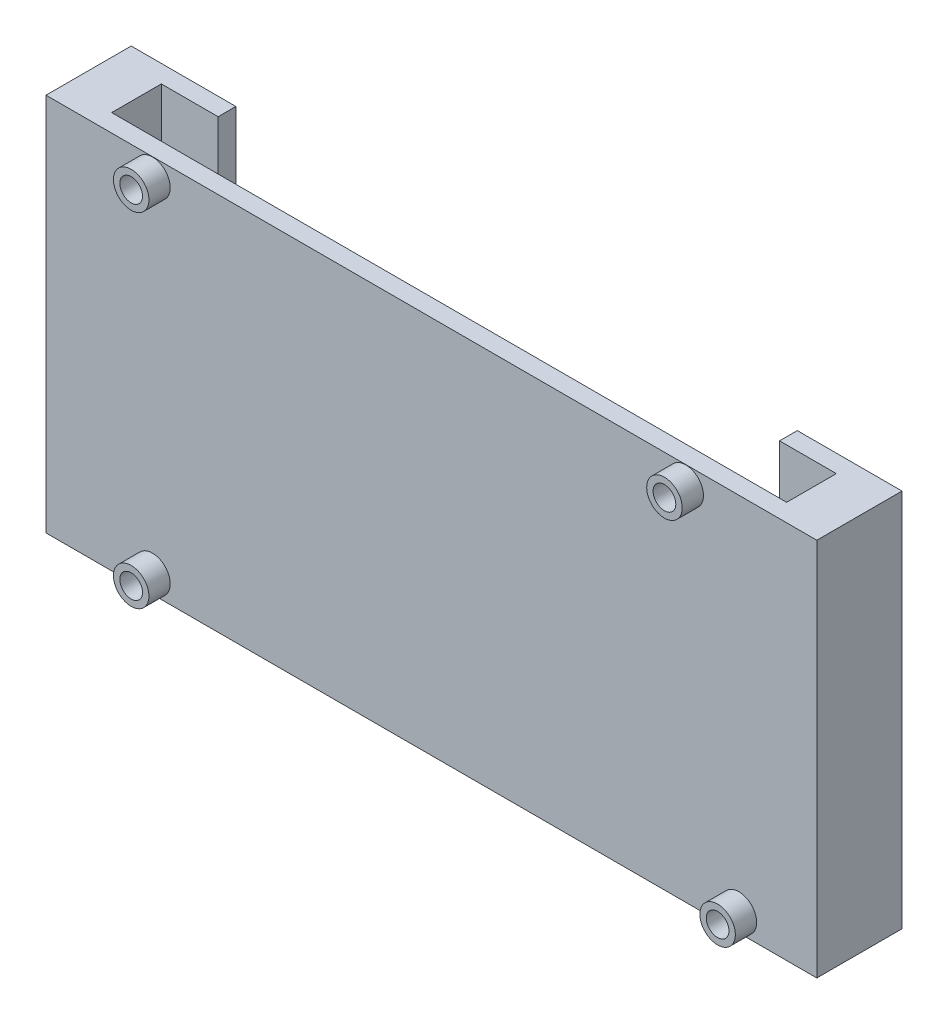
ISO-10303-21;
HEADER;
FILE_DESCRIPTION(('STEP AP214'),'2;1');
FILE_NAME('part.step','',(''),(''),'','','');
FILE_SCHEMA(('AUTOMOTIVE_DESIGN { 1 0 10303 214 1 1 1 1 }'));
ENDSEC;
DATA;
#1=APPLICATION_CONTEXT('core data for automotive mechanical design processes');
#2=APPLICATION_PROTOCOL_DEFINITION('international standard','automotive_design',2000,#1);
#3=PRODUCT_CONTEXT('',#1,'mechanical');
#4=PRODUCT('Part','Part','',(#3));
#5=PRODUCT_RELATED_PRODUCT_CATEGORY('part','',(#4));
#6=PRODUCT_DEFINITION_FORMATION('','',#4);
#7=PRODUCT_DEFINITION_CONTEXT('part definition',#1,'design');
#8=PRODUCT_DEFINITION('design','',#6,#7);
#9=PRODUCT_DEFINITION_SHAPE('','',#8);
#10=(LENGTH_UNIT() NAMED_UNIT(*) SI_UNIT(.MILLI.,.METRE.));
#11=(NAMED_UNIT(*) PLANE_ANGLE_UNIT() SI_UNIT($,.RADIAN.));
#12=(NAMED_UNIT(*) SI_UNIT($,.STERADIAN.) SOLID_ANGLE_UNIT());
#13=UNCERTAINTY_MEASURE_WITH_UNIT(LENGTH_MEASURE(1.E-05),#10,'distance_accuracy_value','');
#14=(GEOMETRIC_REPRESENTATION_CONTEXT(3) GLOBAL_UNCERTAINTY_ASSIGNED_CONTEXT((#13)) GLOBAL_UNIT_ASSIGNED_CONTEXT((#10,
#11,#12)) REPRESENTATION_CONTEXT('',''));
#15=CARTESIAN_POINT('',(0.,0.,0.));
#16=DIRECTION('',(0.,0.,1.));
#17=DIRECTION('',(1.,0.,0.));
#18=AXIS2_PLACEMENT_3D('',#15,#16,#17);
#19=CARTESIAN_POINT('',(-47.55,26.7081,-9.5));
#20=DIRECTION('',(-1.,0.,0.));
#21=DIRECTION('',(0.,-1.,0.));
#22=AXIS2_PLACEMENT_3D('',#19,#20,#21);
#23=PLANE('',#22);
#24=DIRECTION('',(0.,-1.,0.));
#25=VECTOR('',#24,1.);
#26=CARTESIAN_POINT('',(-47.55,26.7081,-7.));
#27=LINE('',#26,#25);
#28=CARTESIAN_POINT('',(-47.55,26.7081,-7.));
#29=VERTEX_POINT('',#28);
#30=CARTESIAN_POINT('',(-47.55,-26.7081,-7.00000000000001));
#31=VERTEX_POINT('',#30);
#32=EDGE_CURVE('E167',#29,#31,#27,.T.);
#33=ORIENTED_EDGE('',*,*,#32,.F.);
#34=DIRECTION('',(0.,0.,1.));
#35=VECTOR('',#34,1.);
#36=CARTESIAN_POINT('',(-47.55,26.7081,-9.5));
#37=LINE('',#36,#35);
#38=CARTESIAN_POINT('',(-47.55,26.7081,0.));
#39=VERTEX_POINT('',#38);
#40=EDGE_CURVE('E209',#29,#39,#37,.T.);
#41=ORIENTED_EDGE('',*,*,#40,.T.);
#42=DIRECTION('',(0.,-1.,0.));
#43=VECTOR('',#42,1.);
#44=CARTESIAN_POINT('',(-47.55,26.7081,0.));
#45=LINE('',#44,#43);
#46=CARTESIAN_POINT('',(-47.55,-26.7081,0.));
#47=VERTEX_POINT('',#46);
#48=EDGE_CURVE('E214',#39,#47,#45,.T.);
#49=ORIENTED_EDGE('',*,*,#48,.T.);
#50=DIRECTION('',(0.,0.,1.));
#51=VECTOR('',#50,1.);
#52=CARTESIAN_POINT('',(-47.55,-26.7081,-9.5));
#53=LINE('',#52,#51);
#54=EDGE_CURVE('E61',#31,#47,#53,.T.);
#55=ORIENTED_EDGE('',*,*,#54,.F.);
#56=EDGE_LOOP('',(#33,#41,#49,#55));
#57=FACE_BOUND('',#56,.T.);
#58=ADVANCED_FACE('F45',(#57),#23,.F.);
#59=CARTESIAN_POINT('',(47.55,26.7081,-9.5));
#60=DIRECTION('',(1.,0.,0.));
#61=DIRECTION('',(0.,1.,0.));
#62=AXIS2_PLACEMENT_3D('',#59,#60,#61);
#63=PLANE('',#62);
#64=DIRECTION('',(0.,1.,0.));
#65=VECTOR('',#64,1.);
#66=CARTESIAN_POINT('',(47.55,26.7081,-7.));
#67=LINE('',#66,#65);
#68=CARTESIAN_POINT('',(47.55,-26.7081,-6.99999999999999));
#69=VERTEX_POINT('',#68);
#70=CARTESIAN_POINT('',(47.55,26.7081,-7.));
#71=VERTEX_POINT('',#70);
#72=EDGE_CURVE('E185',#69,#71,#67,.T.);
#73=ORIENTED_EDGE('',*,*,#72,.F.);
#74=DIRECTION('',(0.,0.,1.));
#75=VECTOR('',#74,1.);
#76=CARTESIAN_POINT('',(47.55,-26.7081,-9.5));
#77=LINE('',#76,#75);
#78=CARTESIAN_POINT('',(47.55,-26.7081,0.));
#79=VERTEX_POINT('',#78);
#80=EDGE_CURVE('E69',#69,#79,#77,.T.);
#81=ORIENTED_EDGE('',*,*,#80,.T.);
#82=DIRECTION('',(0.,1.,0.));
#83=VECTOR('',#82,1.);
#84=CARTESIAN_POINT('',(47.55,26.7081,0.));
#85=LINE('',#84,#83);
#86=CARTESIAN_POINT('',(47.55,26.7081,0.));
#87=VERTEX_POINT('',#86);
#88=EDGE_CURVE('E217',#79,#87,#85,.T.);
#89=ORIENTED_EDGE('',*,*,#88,.T.);
#90=DIRECTION('',(0.,0.,1.));
#91=VECTOR('',#90,1.);
#92=CARTESIAN_POINT('',(47.55,26.7081,-9.5));
#93=LINE('',#92,#91);
#94=EDGE_CURVE('E233',#71,#87,#93,.T.);
#95=ORIENTED_EDGE('',*,*,#94,.F.);
#96=EDGE_LOOP('',(#73,#81,#89,#95));
#97=FACE_BOUND('',#96,.T.);
#98=ADVANCED_FACE('F364',(#97),#63,.F.);
#99=CARTESIAN_POINT('',(0.,0.,0.));
#100=DIRECTION('',(0.,0.,-1.));
#101=DIRECTION('',(-1.,0.,0.));
#102=AXIS2_PLACEMENT_3D('',#99,#100,#101);
#103=PLANE('',#102);
#104=CARTESIAN_POINT('',(-39.3,24.1681,0.));
#105=DIRECTION('',(0.,0.,1.));
#106=DIRECTION('',(1.,0.,0.));
#107=AXIS2_PLACEMENT_3D('',#104,#105,#106);
#108=CIRCLE('',#107,1.6);
#109=CARTESIAN_POINT('',(-37.7,24.1681,0.));
#110=VERTEX_POINT('',#109);
#111=EDGE_CURVE('E244',#110,#110,#108,.T.);
#112=ORIENTED_EDGE('',*,*,#111,.T.);
#113=EDGE_LOOP('',(#112));
#114=FACE_BOUND('',#113,.T.);
#115=CARTESIAN_POINT('',(35.83,24.1681,0.));
#116=DIRECTION('',(0.,0.,1.));
#117=DIRECTION('',(1.,0.,0.));
#118=AXIS2_PLACEMENT_3D('',#115,#116,#117);
#119=CIRCLE('',#118,1.6);
#120=CARTESIAN_POINT('',(37.43,24.1681,0.));
#121=VERTEX_POINT('',#120);
#122=EDGE_CURVE('E252',#121,#121,#119,.T.);
#123=ORIENTED_EDGE('',*,*,#122,.T.);
#124=EDGE_LOOP('',(#123));
#125=FACE_BOUND('',#124,.T.);
#126=CARTESIAN_POINT('',(43.32,-24.16810902,0.));
#127=DIRECTION('',(0.,0.,1.));
#128=DIRECTION('',(1.,0.,0.));
#129=AXIS2_PLACEMENT_3D('',#126,#127,#128);
#130=CIRCLE('',#129,1.6);
#131=CARTESIAN_POINT('',(44.92,-24.16810902,0.));
#132=VERTEX_POINT('',#131);
#133=EDGE_CURVE('E260',#132,#132,#130,.T.);
#134=ORIENTED_EDGE('',*,*,#133,.T.);
#135=EDGE_LOOP('',(#134));
#136=FACE_BOUND('',#135,.T.);
#137=CARTESIAN_POINT('',(-39.3,-24.16810902,0.));
#138=DIRECTION('',(0.,0.,1.));
#139=DIRECTION('',(1.,0.,0.));
#140=AXIS2_PLACEMENT_3D('',#137,#138,#139);
#141=CIRCLE('',#140,1.6);
#142=CARTESIAN_POINT('',(-37.7,-24.16810902,0.));
#143=VERTEX_POINT('',#142);
#144=EDGE_CURVE('E268',#143,#143,#141,.T.);
#145=ORIENTED_EDGE('',*,*,#144,.T.);
#146=EDGE_LOOP('',(#145));
#147=FACE_BOUND('',#146,.T.);
#148=DIRECTION('',(1.,0.,0.));
#149=VECTOR('',#148,1.);
#150=CARTESIAN_POINT('',(-54.3,-26.7081,0.));
#151=LINE('',#150,#149);
#152=EDGE_CURVE('E294',#47,#79,#151,.T.);
#153=ORIENTED_EDGE('',*,*,#152,.F.);
#154=ORIENTED_EDGE('',*,*,#48,.F.);
#155=DIRECTION('',(-1.,0.,0.));
#156=VECTOR('',#155,1.);
#157=CARTESIAN_POINT('',(-54.3,26.7081,0.));
#158=LINE('',#157,#156);
#159=EDGE_CURVE('E288',#87,#39,#158,.T.);
#160=ORIENTED_EDGE('',*,*,#159,.F.);
#161=ORIENTED_EDGE('',*,*,#88,.F.);
#162=EDGE_LOOP('',(#153,#154,#160,#161));
#163=FACE_BOUND('',#162,.T.);
#164=ADVANCED_FACE('F368',(#114,#125,#136,#147,#163),#103,.T.);
#165=CARTESIAN_POINT('',(54.3,-26.7081,2.5));
#166=DIRECTION('',(-1.,0.,0.));
#167=DIRECTION('',(0.,0.,1.));
#168=AXIS2_PLACEMENT_3D('',#165,#166,#167);
#169=PLANE('',#168);
#170=DIRECTION('',(0.,0.,-1.));
#171=VECTOR('',#170,1.);
#172=CARTESIAN_POINT('',(54.3,-26.7081,2.5));
#173=LINE('',#172,#171);
#174=CARTESIAN_POINT('',(54.3,-26.7081,2.5));
#175=VERTEX_POINT('',#174);
#176=CARTESIAN_POINT('',(54.3,-26.7081,-9.5));
#177=VERTEX_POINT('',#176);
#178=EDGE_CURVE('E303',#175,#177,#173,.T.);
#179=ORIENTED_EDGE('',*,*,#178,.T.);
#180=DIRECTION('',(0.,-1.,0.));
#181=VECTOR('',#180,1.);
#182=CARTESIAN_POINT('',(54.3,26.7081,-9.5));
#183=LINE('',#182,#181);
#184=CARTESIAN_POINT('',(54.3,26.7081,-9.5));
#185=VERTEX_POINT('',#184);
#186=EDGE_CURVE('E222',#185,#177,#183,.T.);
#187=ORIENTED_EDGE('',*,*,#186,.F.);
#188=DIRECTION('',(0.,0.,-1.));
#189=VECTOR('',#188,1.);
#190=CARTESIAN_POINT('',(54.3,26.7081,2.5));
#191=LINE('',#190,#189);
#192=CARTESIAN_POINT('',(54.3,26.7081,2.5));
#193=VERTEX_POINT('',#192);
#194=EDGE_CURVE('E317',#193,#185,#191,.T.);
#195=ORIENTED_EDGE('',*,*,#194,.F.);
#196=DIRECTION('',(0.,1.,0.));
#197=VECTOR('',#196,1.);
#198=CARTESIAN_POINT('',(54.3,-26.7081,2.5));
#199=LINE('',#198,#197);
#200=EDGE_CURVE('E289',#175,#193,#199,.T.);
#201=ORIENTED_EDGE('',*,*,#200,.F.);
#202=EDGE_LOOP('',(#179,#187,#195,#201));
#203=FACE_BOUND('',#202,.T.);
#204=ADVANCED_FACE('F47',(#203),#169,.F.);
#205=CARTESIAN_POINT('',(-54.3,26.7081,2.5));
#206=DIRECTION('',(0.,-1.,0.));
#207=DIRECTION('',(0.,0.,-1.));
#208=AXIS2_PLACEMENT_3D('',#205,#206,#207);
#209=PLANE('',#208);
#210=ORIENTED_EDGE('',*,*,#194,.T.);
#211=DIRECTION('',(1.,0.,0.));
#212=VECTOR('',#211,1.);
#213=CARTESIAN_POINT('',(54.3,26.7081,-9.5));
#214=LINE('',#213,#212);
#215=CARTESIAN_POINT('',(39.55,26.7081,-9.5));
#216=VERTEX_POINT('',#215);
#217=EDGE_CURVE('E229',#216,#185,#214,.T.);
#218=ORIENTED_EDGE('',*,*,#217,.F.);
#219=DIRECTION('',(0.,0.,-1.));
#220=VECTOR('',#219,1.);
#221=CARTESIAN_POINT('',(39.55,26.7081,-9.5));
#222=LINE('',#221,#220);
#223=CARTESIAN_POINT('',(39.55,26.7081,-7.));
#224=VERTEX_POINT('',#223);
#225=EDGE_CURVE('E196',#224,#216,#222,.T.);
#226=ORIENTED_EDGE('',*,*,#225,.F.);
#227=DIRECTION('',(1.,0.,0.));
#228=VECTOR('',#227,1.);
#229=CARTESIAN_POINT('',(39.55,26.7081,-7.));
#230=LINE('',#229,#228);
#231=EDGE_CURVE('E200',#224,#71,#230,.T.);
#232=ORIENTED_EDGE('',*,*,#231,.T.);
#233=ORIENTED_EDGE('',*,*,#94,.T.);
#234=ORIENTED_EDGE('',*,*,#159,.T.);
#235=ORIENTED_EDGE('',*,*,#40,.F.);
#236=DIRECTION('',(-1.,0.,0.));
#237=VECTOR('',#236,1.);
#238=CARTESIAN_POINT('',(-39.55,26.7081,-7.));
#239=LINE('',#238,#237);
#240=CARTESIAN_POINT('',(-39.55,26.7081,-7.));
#241=VERTEX_POINT('',#240);
#242=EDGE_CURVE('E156',#241,#29,#239,.T.);
#243=ORIENTED_EDGE('',*,*,#242,.F.);
#244=DIRECTION('',(0.,0.,1.));
#245=VECTOR('',#244,1.);
#246=CARTESIAN_POINT('',(-39.55,26.7081,-9.5));
#247=LINE('',#246,#245);
#248=CARTESIAN_POINT('',(-39.55,26.7081,-9.5));
#249=VERTEX_POINT('',#248);
#250=EDGE_CURVE('E153',#249,#241,#247,.T.);
#251=ORIENTED_EDGE('',*,*,#250,.F.);
#252=DIRECTION('',(1.,0.,0.));
#253=VECTOR('',#252,1.);
#254=CARTESIAN_POINT('',(-54.3,26.7081,-9.5));
#255=LINE('',#254,#253);
#256=CARTESIAN_POINT('',(-54.3,26.7081,-9.5));
#257=VERTEX_POINT('',#256);
#258=EDGE_CURVE('E139',#257,#249,#255,.T.);
#259=ORIENTED_EDGE('',*,*,#258,.F.);
#260=DIRECTION('',(0.,0.,-1.));
#261=VECTOR('',#260,1.);
#262=CARTESIAN_POINT('',(-54.3,26.7081,2.5));
#263=LINE('',#262,#261);
#264=CARTESIAN_POINT('',(-54.3,26.7081,2.5));
#265=VERTEX_POINT('',#264);
#266=EDGE_CURVE('E314',#265,#257,#263,.T.);
#267=ORIENTED_EDGE('',*,*,#266,.F.);
#268=DIRECTION('',(-1.,0.,0.));
#269=VECTOR('',#268,1.);
#270=CARTESIAN_POINT('',(-54.3,26.7081,2.5));
#271=LINE('',#270,#269);
#272=EDGE_CURVE('E293',#193,#265,#271,.T.);
#273=ORIENTED_EDGE('',*,*,#272,.F.);
#274=EDGE_LOOP('',(#210,#218,#226,#232,#233,#234,#235,#243,#251,#259,#267,#273));
#275=FACE_BOUND('',#274,.T.);
#276=ADVANCED_FACE('F154',(#275),#209,.F.);
#277=CARTESIAN_POINT('',(-54.3,-26.7081,2.5));
#278=DIRECTION('',(1.,0.,0.));
#279=DIRECTION('',(0.,0.,-1.));
#280=AXIS2_PLACEMENT_3D('',#277,#278,#279);
#281=PLANE('',#280);
#282=ORIENTED_EDGE('',*,*,#266,.T.);
#283=DIRECTION('',(0.,1.,0.));
#284=VECTOR('',#283,1.);
#285=CARTESIAN_POINT('',(-54.3,26.7081,-9.5));
#286=LINE('',#285,#284);
#287=CARTESIAN_POINT('',(-54.3,-26.7081,-9.5));
#288=VERTEX_POINT('',#287);
#289=EDGE_CURVE('E146',#288,#257,#286,.T.);
#290=ORIENTED_EDGE('',*,*,#289,.F.);
#291=DIRECTION('',(0.,0.,-1.));
#292=VECTOR('',#291,1.);
#293=CARTESIAN_POINT('',(-54.3,-26.7081,2.5));
#294=LINE('',#293,#292);
#295=CARTESIAN_POINT('',(-54.3,-26.7081,2.5));
#296=VERTEX_POINT('',#295);
#297=EDGE_CURVE('E311',#296,#288,#294,.T.);
#298=ORIENTED_EDGE('',*,*,#297,.F.);
#299=DIRECTION('',(0.,-1.,0.));
#300=VECTOR('',#299,1.);
#301=CARTESIAN_POINT('',(-54.3,-26.7081,2.5));
#302=LINE('',#301,#300);
#303=EDGE_CURVE('E297',#265,#296,#302,.T.);
#304=ORIENTED_EDGE('',*,*,#303,.F.);
#305=EDGE_LOOP('',(#282,#290,#298,#304));
#306=FACE_BOUND('',#305,.T.);
#307=ADVANCED_FACE('F377',(#306),#281,.F.);
#308=CARTESIAN_POINT('',(-54.3,-26.7081,2.5));
#309=DIRECTION('',(0.,1.,0.));
#310=DIRECTION('',(0.,0.,1.));
#311=AXIS2_PLACEMENT_3D('',#308,#309,#310);
#312=PLANE('',#311);
#313=CARTESIAN_POINT('',(-50.925,-26.7081,-3.5));
#314=DIRECTION('',(0.,-1.,0.));
#315=DIRECTION('',(0.,0.,-1.));
#316=AXIS2_PLACEMENT_3D('',#313,#314,#315);
#317=CIRCLE('',#316,3.15);
#318=CARTESIAN_POINT('',(-50.925,-26.7081,-6.65));
#319=VERTEX_POINT('',#318);
#320=EDGE_CURVE('E576',#319,#319,#317,.T.);
#321=ORIENTED_EDGE('',*,*,#320,.F.);
#322=EDGE_LOOP('',(#321));
#323=FACE_BOUND('',#322,.T.);
#324=CARTESIAN_POINT('',(50.925,-26.7081,-3.5));
#325=DIRECTION('',(0.,-1.,0.));
#326=DIRECTION('',(0.,0.,-1.));
#327=AXIS2_PLACEMENT_3D('',#324,#325,#326);
#328=CIRCLE('',#327,3.15);
#329=CARTESIAN_POINT('',(50.925,-26.7081,-6.65));
#330=VERTEX_POINT('',#329);
#331=EDGE_CURVE('E580',#330,#330,#328,.T.);
#332=ORIENTED_EDGE('',*,*,#331,.F.);
#333=EDGE_LOOP('',(#332));
#334=FACE_BOUND('',#333,.T.);
#335=ORIENTED_EDGE('',*,*,#297,.T.);
#336=DIRECTION('',(-1.,0.,0.));
#337=VECTOR('',#336,1.);
#338=CARTESIAN_POINT('',(-54.3,-26.7081,-9.5));
#339=LINE('',#338,#337);
#340=CARTESIAN_POINT('',(-39.55,-26.7081,-9.50000000000001));
#341=VERTEX_POINT('',#340);
#342=EDGE_CURVE('E150',#341,#288,#339,.T.);
#343=ORIENTED_EDGE('',*,*,#342,.F.);
#344=DIRECTION('',(0.,0.,-1.));
#345=VECTOR('',#344,1.);
#346=CARTESIAN_POINT('',(-39.55,-26.7081,-9.50000000000001));
#347=LINE('',#346,#345);
#348=CARTESIAN_POINT('',(-39.55,-26.7081,-7.00000000000001));
#349=VERTEX_POINT('',#348);
#350=EDGE_CURVE('E165',#349,#341,#347,.T.);
#351=ORIENTED_EDGE('',*,*,#350,.F.);
#352=DIRECTION('',(-1.,0.,0.));
#353=VECTOR('',#352,1.);
#354=CARTESIAN_POINT('',(-39.55,-26.7081,-7.00000000000001));
#355=LINE('',#354,#353);
#356=EDGE_CURVE('E179',#349,#31,#355,.T.);
#357=ORIENTED_EDGE('',*,*,#356,.T.);
#358=ORIENTED_EDGE('',*,*,#54,.T.);
#359=ORIENTED_EDGE('',*,*,#152,.T.);
#360=ORIENTED_EDGE('',*,*,#80,.F.);
#361=DIRECTION('',(1.,0.,0.));
#362=VECTOR('',#361,1.);
#363=CARTESIAN_POINT('',(39.55,-26.7081,-6.99999999999999));
#364=LINE('',#363,#362);
#365=CARTESIAN_POINT('',(39.55,-26.7081,-6.99999999999999));
#366=VERTEX_POINT('',#365);
#367=EDGE_CURVE('E206',#366,#69,#364,.T.);
#368=ORIENTED_EDGE('',*,*,#367,.F.);
#369=DIRECTION('',(0.,0.,1.));
#370=VECTOR('',#369,1.);
#371=CARTESIAN_POINT('',(39.55,-26.7081,-9.49999999999999));
#372=LINE('',#371,#370);
#373=CARTESIAN_POINT('',(39.55,-26.7081,-9.49999999999999));
#374=VERTEX_POINT('',#373);
#375=EDGE_CURVE('E190',#374,#366,#372,.T.);
#376=ORIENTED_EDGE('',*,*,#375,.F.);
#377=DIRECTION('',(-1.,0.,0.));
#378=VECTOR('',#377,1.);
#379=CARTESIAN_POINT('',(54.3,-26.7081,-9.5));
#380=LINE('',#379,#378);
#381=EDGE_CURVE('E226',#177,#374,#380,.T.);
#382=ORIENTED_EDGE('',*,*,#381,.F.);
#383=ORIENTED_EDGE('',*,*,#178,.F.);
#384=DIRECTION('',(1.,0.,0.));
#385=VECTOR('',#384,1.);
#386=CARTESIAN_POINT('',(-54.3,-26.7081,2.5));
#387=LINE('',#386,#385);
#388=EDGE_CURVE('E300',#296,#175,#387,.T.);
#389=ORIENTED_EDGE('',*,*,#388,.F.);
#390=EDGE_LOOP('',(#335,#343,#351,#357,#358,#359,#360,#368,#376,#382,#383,#389));
#391=FACE_BOUND('',#390,.T.);
#392=ADVANCED_FACE('F337',(#323,#334,#391),#312,.F.);
#393=CARTESIAN_POINT('',(0.,0.,2.5));
#394=DIRECTION('',(0.,0.,-1.));
#395=DIRECTION('',(-1.,0.,0.));
#396=AXIS2_PLACEMENT_3D('',#393,#394,#395);
#397=PLANE('',#396);
#398=CARTESIAN_POINT('',(-39.3,-24.16810902,2.5));
#399=DIRECTION('',(0.,0.,-1.));
#400=DIRECTION('',(-1.,0.,0.));
#401=AXIS2_PLACEMENT_3D('',#398,#399,#400);
#402=CIRCLE('',#401,2.5);
#403=CARTESIAN_POINT('',(-41.8,-24.16810902,2.5));
#404=VERTEX_POINT('',#403);
#405=EDGE_CURVE('E11',#404,#404,#402,.F.);
#406=ORIENTED_EDGE('',*,*,#405,.F.);
#407=EDGE_LOOP('',(#406));
#408=FACE_BOUND('',#407,.T.);
#409=CARTESIAN_POINT('',(43.32,-24.16810902,2.5));
#410=DIRECTION('',(0.,0.,-1.));
#411=DIRECTION('',(-1.,0.,0.));
#412=AXIS2_PLACEMENT_3D('',#409,#410,#411);
#413=CIRCLE('',#412,2.5);
#414=CARTESIAN_POINT('',(40.82,-24.16810902,2.5));
#415=VERTEX_POINT('',#414);
#416=EDGE_CURVE('E54',#415,#415,#413,.F.);
#417=ORIENTED_EDGE('',*,*,#416,.F.);
#418=EDGE_LOOP('',(#417));
#419=FACE_BOUND('',#418,.T.);
#420=CARTESIAN_POINT('',(35.83,24.1681,2.5));
#421=DIRECTION('',(0.,0.,-1.));
#422=DIRECTION('',(-1.,0.,0.));
#423=AXIS2_PLACEMENT_3D('',#420,#421,#422);
#424=CIRCLE('',#423,2.5);
#425=CARTESIAN_POINT('',(33.33,24.1681,2.5));
#426=VERTEX_POINT('',#425);
#427=EDGE_CURVE('E324',#426,#426,#424,.F.);
#428=ORIENTED_EDGE('',*,*,#427,.F.);
#429=EDGE_LOOP('',(#428));
#430=FACE_BOUND('',#429,.T.);
#431=CARTESIAN_POINT('',(-39.3,24.1681,2.5));
#432=DIRECTION('',(0.,0.,-1.));
#433=DIRECTION('',(-1.,0.,0.));
#434=AXIS2_PLACEMENT_3D('',#431,#432,#433);
#435=CIRCLE('',#434,2.5);
#436=CARTESIAN_POINT('',(-41.8,24.1681,2.5));
#437=VERTEX_POINT('',#436);
#438=EDGE_CURVE('E320',#437,#437,#435,.F.);
#439=ORIENTED_EDGE('',*,*,#438,.F.);
#440=EDGE_LOOP('',(#439));
#441=FACE_BOUND('',#440,.T.);
#442=ORIENTED_EDGE('',*,*,#200,.T.);
#443=ORIENTED_EDGE('',*,*,#272,.T.);
#444=ORIENTED_EDGE('',*,*,#303,.T.);
#445=ORIENTED_EDGE('',*,*,#388,.T.);
#446=EDGE_LOOP('',(#442,#443,#444,#445));
#447=FACE_BOUND('',#446,.T.);
#448=ADVANCED_FACE('F333',(#408,#419,#430,#441,#447),#397,.F.);
#449=CARTESIAN_POINT('',(-39.3,24.1681,5.5));
#450=DIRECTION('',(0.,0.,-1.));
#451=DIRECTION('',(-1.,0.,0.));
#452=AXIS2_PLACEMENT_3D('',#449,#450,#451);
#453=CYLINDRICAL_SURFACE('',#452,2.5);
#454=CARTESIAN_POINT('',(-39.3,24.1681,5.5));
#455=DIRECTION('',(0.,0.,1.));
#456=DIRECTION('',(1.,0.,0.));
#457=AXIS2_PLACEMENT_3D('',#454,#455,#456);
#458=CIRCLE('',#457,2.5);
#459=CARTESIAN_POINT('',(-36.8,24.1681,5.5));
#460=VERTEX_POINT('',#459);
#461=EDGE_CURVE('E284',#460,#460,#458,.T.);
#462=ORIENTED_EDGE('',*,*,#461,.F.);
#463=EDGE_LOOP('',(#462));
#464=FACE_BOUND('',#463,.T.);
#465=ORIENTED_EDGE('',*,*,#438,.T.);
#466=EDGE_LOOP('',(#465));
#467=FACE_BOUND('',#466,.T.);
#468=ADVANCED_FACE('F336',(#464,#467),#453,.T.);
#469=CARTESIAN_POINT('',(-39.3,24.1681,5.5));
#470=DIRECTION('',(0.,0.,1.));
#471=DIRECTION('',(1.,0.,0.));
#472=AXIS2_PLACEMENT_3D('',#469,#470,#471);
#473=PLANE('',#472);
#474=CARTESIAN_POINT('',(-39.3,24.1681,5.5));
#475=DIRECTION('',(0.,0.,1.));
#476=DIRECTION('',(1.,0.,0.));
#477=AXIS2_PLACEMENT_3D('',#474,#475,#476);
#478=CIRCLE('',#477,1.6);
#479=CARTESIAN_POINT('',(-37.7,24.1681,5.5));
#480=VERTEX_POINT('',#479);
#481=EDGE_CURVE('E240',#480,#480,#478,.T.);
#482=ORIENTED_EDGE('',*,*,#481,.F.);
#483=EDGE_LOOP('',(#482));
#484=FACE_BOUND('',#483,.T.);
#485=ORIENTED_EDGE('',*,*,#461,.T.);
#486=EDGE_LOOP('',(#485));
#487=FACE_BOUND('',#486,.T.);
#488=ADVANCED_FACE('F433',(#484,#487),#473,.T.);
#489=CARTESIAN_POINT('',(35.83,24.1681,5.5));
#490=DIRECTION('',(0.,0.,-1.));
#491=DIRECTION('',(-1.,0.,0.));
#492=AXIS2_PLACEMENT_3D('',#489,#490,#491);
#493=CYLINDRICAL_SURFACE('',#492,2.5);
#494=CARTESIAN_POINT('',(35.83,24.1681,5.5));
#495=DIRECTION('',(0.,0.,1.));
#496=DIRECTION('',(1.,0.,0.));
#497=AXIS2_PLACEMENT_3D('',#494,#495,#496);
#498=CIRCLE('',#497,2.5);
#499=CARTESIAN_POINT('',(38.33,24.1681,5.5));
#500=VERTEX_POINT('',#499);
#501=EDGE_CURVE('E280',#500,#500,#498,.T.);
#502=ORIENTED_EDGE('',*,*,#501,.F.);
#503=EDGE_LOOP('',(#502));
#504=FACE_BOUND('',#503,.T.);
#505=ORIENTED_EDGE('',*,*,#427,.T.);
#506=EDGE_LOOP('',(#505));
#507=FACE_BOUND('',#506,.T.);
#508=ADVANCED_FACE('F430',(#504,#507),#493,.T.);
#509=CARTESIAN_POINT('',(35.83,24.1681,5.5));
#510=DIRECTION('',(0.,0.,1.));
#511=DIRECTION('',(1.,0.,0.));
#512=AXIS2_PLACEMENT_3D('',#509,#510,#511);
#513=PLANE('',#512);
#514=CARTESIAN_POINT('',(35.83,24.1681,5.5));
#515=DIRECTION('',(0.,0.,1.));
#516=DIRECTION('',(1.,0.,0.));
#517=AXIS2_PLACEMENT_3D('',#514,#515,#516);
#518=CIRCLE('',#517,1.6);
#519=CARTESIAN_POINT('',(37.43,24.1681,5.5));
#520=VERTEX_POINT('',#519);
#521=EDGE_CURVE('E248',#520,#520,#518,.T.);
#522=ORIENTED_EDGE('',*,*,#521,.F.);
#523=EDGE_LOOP('',(#522));
#524=FACE_BOUND('',#523,.T.);
#525=ORIENTED_EDGE('',*,*,#501,.T.);
#526=EDGE_LOOP('',(#525));
#527=FACE_BOUND('',#526,.T.);
#528=ADVANCED_FACE('F425',(#524,#527),#513,.T.);
#529=CARTESIAN_POINT('',(43.32,-24.16810902,5.5));
#530=DIRECTION('',(0.,0.,-1.));
#531=DIRECTION('',(-1.,0.,0.));
#532=AXIS2_PLACEMENT_3D('',#529,#530,#531);
#533=CYLINDRICAL_SURFACE('',#532,2.5);
#534=CARTESIAN_POINT('',(43.32,-24.16810902,5.5));
#535=DIRECTION('',(0.,0.,1.));
#536=DIRECTION('',(1.,0.,0.));
#537=AXIS2_PLACEMENT_3D('',#534,#535,#536);
#538=CIRCLE('',#537,2.5);
#539=CARTESIAN_POINT('',(45.82,-24.16810902,5.5));
#540=VERTEX_POINT('',#539);
#541=EDGE_CURVE('E276',#540,#540,#538,.T.);
#542=ORIENTED_EDGE('',*,*,#541,.F.);
#543=EDGE_LOOP('',(#542));
#544=FACE_BOUND('',#543,.T.);
#545=ORIENTED_EDGE('',*,*,#416,.T.);
#546=EDGE_LOOP('',(#545));
#547=FACE_BOUND('',#546,.T.);
#548=ADVANCED_FACE('F331',(#544,#547),#533,.T.);
#549=CARTESIAN_POINT('',(43.32,-24.16810902,5.5));
#550=DIRECTION('',(0.,0.,1.));
#551=DIRECTION('',(1.,0.,0.));
#552=AXIS2_PLACEMENT_3D('',#549,#550,#551);
#553=PLANE('',#552);
#554=CARTESIAN_POINT('',(43.32,-24.16810902,5.5));
#555=DIRECTION('',(0.,0.,1.));
#556=DIRECTION('',(1.,0.,0.));
#557=AXIS2_PLACEMENT_3D('',#554,#555,#556);
#558=CIRCLE('',#557,1.6);
#559=CARTESIAN_POINT('',(44.92,-24.16810902,5.5));
#560=VERTEX_POINT('',#559);
#561=EDGE_CURVE('E256',#560,#560,#558,.T.);
#562=ORIENTED_EDGE('',*,*,#561,.F.);
#563=EDGE_LOOP('',(#562));
#564=FACE_BOUND('',#563,.T.);
#565=ORIENTED_EDGE('',*,*,#541,.T.);
#566=EDGE_LOOP('',(#565));
#567=FACE_BOUND('',#566,.T.);
#568=ADVANCED_FACE('F418',(#564,#567),#553,.T.);
#569=CARTESIAN_POINT('',(-39.3,-24.16810902,5.5));
#570=DIRECTION('',(0.,0.,-1.));
#571=DIRECTION('',(-1.,0.,0.));
#572=AXIS2_PLACEMENT_3D('',#569,#570,#571);
#573=CYLINDRICAL_SURFACE('',#572,2.5);
#574=CARTESIAN_POINT('',(-39.3,-24.16810902,5.5));
#575=DIRECTION('',(0.,0.,1.));
#576=DIRECTION('',(1.,0.,0.));
#577=AXIS2_PLACEMENT_3D('',#574,#575,#576);
#578=CIRCLE('',#577,2.5);
#579=CARTESIAN_POINT('',(-36.8,-24.16810902,5.5));
#580=VERTEX_POINT('',#579);
#581=EDGE_CURVE('E272',#580,#580,#578,.T.);
#582=ORIENTED_EDGE('',*,*,#581,.F.);
#583=EDGE_LOOP('',(#582));
#584=FACE_BOUND('',#583,.T.);
#585=ORIENTED_EDGE('',*,*,#405,.T.);
#586=EDGE_LOOP('',(#585));
#587=FACE_BOUND('',#586,.T.);
#588=ADVANCED_FACE('F415',(#584,#587),#573,.T.);
#589=CARTESIAN_POINT('',(-39.3,-24.16810902,5.5));
#590=DIRECTION('',(0.,0.,1.));
#591=DIRECTION('',(1.,0.,0.));
#592=AXIS2_PLACEMENT_3D('',#589,#590,#591);
#593=PLANE('',#592);
#594=CARTESIAN_POINT('',(-39.3,-24.16810902,5.5));
#595=DIRECTION('',(0.,0.,1.));
#596=DIRECTION('',(1.,0.,0.));
#597=AXIS2_PLACEMENT_3D('',#594,#595,#596);
#598=CIRCLE('',#597,1.6);
#599=CARTESIAN_POINT('',(-37.7,-24.16810902,5.5));
#600=VERTEX_POINT('',#599);
#601=EDGE_CURVE('E264',#600,#600,#598,.T.);
#602=ORIENTED_EDGE('',*,*,#601,.F.);
#603=EDGE_LOOP('',(#602));
#604=FACE_BOUND('',#603,.T.);
#605=ORIENTED_EDGE('',*,*,#581,.T.);
#606=EDGE_LOOP('',(#605));
#607=FACE_BOUND('',#606,.T.);
#608=ADVANCED_FACE('F413',(#604,#607),#593,.T.);
#609=CARTESIAN_POINT('',(-39.3,-24.16810902,5.5));
#610=DIRECTION('',(0.,0.,1.));
#611=DIRECTION('',(1.,0.,0.));
#612=AXIS2_PLACEMENT_3D('',#609,#610,#611);
#613=CYLINDRICAL_SURFACE('',#612,1.6);
#614=ORIENTED_EDGE('',*,*,#144,.F.);
#615=EDGE_LOOP('',(#614));
#616=FACE_BOUND('',#615,.T.);
#617=ORIENTED_EDGE('',*,*,#601,.T.);
#618=EDGE_LOOP('',(#617));
#619=FACE_BOUND('',#618,.T.);
#620=ADVANCED_FACE('F409',(#616,#619),#613,.F.);
#621=CARTESIAN_POINT('',(43.32,-24.16810902,5.5));
#622=DIRECTION('',(0.,0.,1.));
#623=DIRECTION('',(1.,0.,0.));
#624=AXIS2_PLACEMENT_3D('',#621,#622,#623);
#625=CYLINDRICAL_SURFACE('',#624,1.6);
#626=ORIENTED_EDGE('',*,*,#133,.F.);
#627=EDGE_LOOP('',(#626));
#628=FACE_BOUND('',#627,.T.);
#629=ORIENTED_EDGE('',*,*,#561,.T.);
#630=EDGE_LOOP('',(#629));
#631=FACE_BOUND('',#630,.T.);
#632=ADVANCED_FACE('F405',(#628,#631),#625,.F.);
#633=CARTESIAN_POINT('',(35.83,24.1681,5.5));
#634=DIRECTION('',(0.,0.,1.));
#635=DIRECTION('',(1.,0.,0.));
#636=AXIS2_PLACEMENT_3D('',#633,#634,#635);
#637=CYLINDRICAL_SURFACE('',#636,1.6);
#638=ORIENTED_EDGE('',*,*,#122,.F.);
#639=EDGE_LOOP('',(#638));
#640=FACE_BOUND('',#639,.T.);
#641=ORIENTED_EDGE('',*,*,#521,.T.);
#642=EDGE_LOOP('',(#641));
#643=FACE_BOUND('',#642,.T.);
#644=ADVANCED_FACE('F401',(#640,#643),#637,.F.);
#645=CARTESIAN_POINT('',(-39.3,24.1681,5.5));
#646=DIRECTION('',(0.,0.,1.));
#647=DIRECTION('',(1.,0.,0.));
#648=AXIS2_PLACEMENT_3D('',#645,#646,#647);
#649=CYLINDRICAL_SURFACE('',#648,1.6);
#650=ORIENTED_EDGE('',*,*,#111,.F.);
#651=EDGE_LOOP('',(#650));
#652=FACE_BOUND('',#651,.T.);
#653=ORIENTED_EDGE('',*,*,#481,.T.);
#654=EDGE_LOOP('',(#653));
#655=FACE_BOUND('',#654,.T.);
#656=ADVANCED_FACE('F397',(#652,#655),#649,.F.);
#657=CARTESIAN_POINT('',(0.,0.,-9.5));
#658=DIRECTION('',(0.,0.,-1.));
#659=DIRECTION('',(-1.,0.,0.));
#660=AXIS2_PLACEMENT_3D('',#657,#658,#659);
#661=PLANE('',#660);
#662=ORIENTED_EDGE('',*,*,#186,.T.);
#663=ORIENTED_EDGE('',*,*,#381,.T.);
#664=DIRECTION('',(0.,-1.,0.));
#665=VECTOR('',#664,1.);
#666=CARTESIAN_POINT('',(39.55,26.7081,-9.5));
#667=LINE('',#666,#665);
#668=EDGE_CURVE('E186',#216,#374,#667,.T.);
#669=ORIENTED_EDGE('',*,*,#668,.F.);
#670=ORIENTED_EDGE('',*,*,#217,.T.);
#671=EDGE_LOOP('',(#662,#663,#669,#670));
#672=FACE_BOUND('',#671,.T.);
#673=ADVANCED_FACE('F353',(#672),#661,.T.);
#674=CARTESIAN_POINT('',(0.,0.,-9.5));
#675=DIRECTION('',(0.,0.,1.));
#676=DIRECTION('',(1.,0.,0.));
#677=AXIS2_PLACEMENT_3D('',#674,#675,#676);
#678=PLANE('',#677);
#679=ORIENTED_EDGE('',*,*,#289,.T.);
#680=ORIENTED_EDGE('',*,*,#258,.T.);
#681=DIRECTION('',(0.,1.,0.));
#682=VECTOR('',#681,1.);
#683=CARTESIAN_POINT('',(-39.55,26.7081,-9.5));
#684=LINE('',#683,#682);
#685=EDGE_CURVE('E144',#341,#249,#684,.T.);
#686=ORIENTED_EDGE('',*,*,#685,.F.);
#687=ORIENTED_EDGE('',*,*,#342,.T.);
#688=EDGE_LOOP('',(#679,#680,#686,#687));
#689=FACE_BOUND('',#688,.T.);
#690=ADVANCED_FACE('F141',(#689),#678,.F.);
#691=CARTESIAN_POINT('',(39.55,26.7081,-7.));
#692=DIRECTION('',(0.,0.,-1.));
#693=DIRECTION('',(0.,1.,0.));
#694=AXIS2_PLACEMENT_3D('',#691,#692,#693);
#695=PLANE('',#694);
#696=ORIENTED_EDGE('',*,*,#72,.T.);
#697=ORIENTED_EDGE('',*,*,#231,.F.);
#698=DIRECTION('',(0.,1.,0.));
#699=VECTOR('',#698,1.);
#700=CARTESIAN_POINT('',(39.55,26.7081,-7.));
#701=LINE('',#700,#699);
#702=EDGE_CURVE('E193',#366,#224,#701,.T.);
#703=ORIENTED_EDGE('',*,*,#702,.F.);
#704=ORIENTED_EDGE('',*,*,#367,.T.);
#705=EDGE_LOOP('',(#696,#697,#703,#704));
#706=FACE_BOUND('',#705,.T.);
#707=ADVANCED_FACE('F379',(#706),#695,.F.);
#708=CARTESIAN_POINT('',(39.55,0.,0.));
#709=DIRECTION('',(-1.,0.,0.));
#710=DIRECTION('',(0.,-1.,0.));
#711=AXIS2_PLACEMENT_3D('',#708,#709,#710);
#712=PLANE('',#711);
#713=ORIENTED_EDGE('',*,*,#668,.T.);
#714=ORIENTED_EDGE('',*,*,#375,.T.);
#715=ORIENTED_EDGE('',*,*,#702,.T.);
#716=ORIENTED_EDGE('',*,*,#225,.T.);
#717=EDGE_LOOP('',(#713,#714,#715,#716));
#718=FACE_BOUND('',#717,.T.);
#719=ADVANCED_FACE('F357',(#718),#712,.T.);
#720=CARTESIAN_POINT('',(-39.55,26.7081,-7.));
#721=DIRECTION('',(0.,0.,-1.));
#722=DIRECTION('',(0.,1.,0.));
#723=AXIS2_PLACEMENT_3D('',#720,#721,#722);
#724=PLANE('',#723);
#725=ORIENTED_EDGE('',*,*,#32,.T.);
#726=ORIENTED_EDGE('',*,*,#356,.F.);
#727=DIRECTION('',(0.,-1.,0.));
#728=VECTOR('',#727,1.);
#729=CARTESIAN_POINT('',(-39.55,26.7081,-7.));
#730=LINE('',#729,#728);
#731=EDGE_CURVE('E160',#241,#349,#730,.T.);
#732=ORIENTED_EDGE('',*,*,#731,.F.);
#733=ORIENTED_EDGE('',*,*,#242,.T.);
#734=EDGE_LOOP('',(#725,#726,#732,#733));
#735=FACE_BOUND('',#734,.T.);
#736=ADVANCED_FACE('F374',(#735),#724,.F.);
#737=CARTESIAN_POINT('',(-39.55,0.,0.));
#738=DIRECTION('',(-1.,0.,0.));
#739=DIRECTION('',(0.,-1.,0.));
#740=AXIS2_PLACEMENT_3D('',#737,#738,#739);
#741=PLANE('',#740);
#742=ORIENTED_EDGE('',*,*,#685,.T.);
#743=ORIENTED_EDGE('',*,*,#250,.T.);
#744=ORIENTED_EDGE('',*,*,#731,.T.);
#745=ORIENTED_EDGE('',*,*,#350,.T.);
#746=EDGE_LOOP('',(#742,#743,#744,#745));
#747=FACE_BOUND('',#746,.T.);
#748=ADVANCED_FACE('F163',(#747),#741,.F.);
#749=CARTESIAN_POINT('',(50.925,-24.0081,-3.5));
#750=DIRECTION('',(0.,-1.,0.));
#751=DIRECTION('',(0.,0.,-1.));
#752=AXIS2_PLACEMENT_3D('',#749,#750,#751);
#753=CYLINDRICAL_SURFACE('',#752,3.15);
#754=CARTESIAN_POINT('',(50.925,-24.0081,-3.5));
#755=DIRECTION('',(0.,-1.,0.));
#756=DIRECTION('',(0.,0.,-1.));
#757=AXIS2_PLACEMENT_3D('',#754,#755,#756);
#758=CIRCLE('',#757,3.15);
#759=CARTESIAN_POINT('',(50.925,-24.0081,-6.65));
#760=VERTEX_POINT('',#759);
#761=EDGE_CURVE('E173',#760,#760,#758,.T.);
#762=CARTESIAN_POINT('',(50.925,-24.0081,-6.65));
#763=CARTESIAN_POINT('',(50.925,-24.036225,-6.65));
#764=CARTESIAN_POINT('',(50.925,-24.06435,-6.65));
#765=CARTESIAN_POINT('',(50.925,-24.1206,-6.65));
#766=CARTESIAN_POINT('',(50.925,-24.148725,-6.65));
#767=CARTESIAN_POINT('',(50.925,-24.204975,-6.65));
#768=CARTESIAN_POINT('',(50.925,-24.2331,-6.65));
#769=CARTESIAN_POINT('',(50.925,-24.28935,-6.65));
#770=CARTESIAN_POINT('',(50.925,-24.317475,-6.65));
#771=CARTESIAN_POINT('',(50.925,-24.373725,-6.65));
#772=CARTESIAN_POINT('',(50.925,-24.40185,-6.65));
#773=CARTESIAN_POINT('',(50.925,-24.4581,-6.65));
#774=CARTESIAN_POINT('',(50.925,-24.486225,-6.65));
#775=CARTESIAN_POINT('',(50.925,-24.542475,-6.65));
#776=CARTESIAN_POINT('',(50.925,-24.5706,-6.65));
#777=CARTESIAN_POINT('',(50.925,-24.62685,-6.65));
#778=CARTESIAN_POINT('',(50.925,-24.654975,-6.65));
#779=CARTESIAN_POINT('',(50.925,-24.711225,-6.65));
#780=CARTESIAN_POINT('',(50.925,-24.73935,-6.65));
#781=CARTESIAN_POINT('',(50.925,-24.7956,-6.65));
#782=CARTESIAN_POINT('',(50.925,-24.823725,-6.65));
#783=CARTESIAN_POINT('',(50.925,-24.879975,-6.65));
#784=CARTESIAN_POINT('',(50.925,-24.9081,-6.65));
#785=CARTESIAN_POINT('',(50.925,-24.96435,-6.65));
#786=CARTESIAN_POINT('',(50.925,-24.992475,-6.65));
#787=CARTESIAN_POINT('',(50.925,-25.048725,-6.65));
#788=CARTESIAN_POINT('',(50.925,-25.07685,-6.65));
#789=CARTESIAN_POINT('',(50.925,-25.1331,-6.65));
#790=CARTESIAN_POINT('',(50.925,-25.161225,-6.65));
#791=CARTESIAN_POINT('',(50.925,-25.217475,-6.65));
#792=CARTESIAN_POINT('',(50.925,-25.2456,-6.65));
#793=CARTESIAN_POINT('',(50.925,-25.30185,-6.65));
#794=CARTESIAN_POINT('',(50.925,-25.329975,-6.65));
#795=CARTESIAN_POINT('',(50.925,-25.386225,-6.65));
#796=CARTESIAN_POINT('',(50.925,-25.41435,-6.65));
#797=CARTESIAN_POINT('',(50.925,-25.4706,-6.65));
#798=CARTESIAN_POINT('',(50.925,-25.498725,-6.65));
#799=CARTESIAN_POINT('',(50.925,-25.554975,-6.65));
#800=CARTESIAN_POINT('',(50.925,-25.5831,-6.65));
#801=CARTESIAN_POINT('',(50.925,-25.63935,-6.65));
#802=CARTESIAN_POINT('',(50.925,-25.667475,-6.65));
#803=CARTESIAN_POINT('',(50.925,-25.723725,-6.65));
#804=CARTESIAN_POINT('',(50.925,-25.75185,-6.65));
#805=CARTESIAN_POINT('',(50.925,-25.8081,-6.65));
#806=CARTESIAN_POINT('',(50.925,-25.836225,-6.65));
#807=CARTESIAN_POINT('',(50.925,-25.892475,-6.65));
#808=CARTESIAN_POINT('',(50.925,-25.9206,-6.65));
#809=CARTESIAN_POINT('',(50.925,-25.97685,-6.65));
#810=CARTESIAN_POINT('',(50.925,-26.004975,-6.65));
#811=CARTESIAN_POINT('',(50.925,-26.061225,-6.65));
#812=CARTESIAN_POINT('',(50.925,-26.08935,-6.65));
#813=CARTESIAN_POINT('',(50.925,-26.1456,-6.65));
#814=CARTESIAN_POINT('',(50.925,-26.173725,-6.65));
#815=CARTESIAN_POINT('',(50.925,-26.229975,-6.65));
#816=CARTESIAN_POINT('',(50.925,-26.2581,-6.65));
#817=CARTESIAN_POINT('',(50.925,-26.31435,-6.65));
#818=CARTESIAN_POINT('',(50.925,-26.342475,-6.65));
#819=CARTESIAN_POINT('',(50.925,-26.398725,-6.65));
#820=CARTESIAN_POINT('',(50.925,-26.42685,-6.65));
#821=CARTESIAN_POINT('',(50.925,-26.4831,-6.65));
#822=CARTESIAN_POINT('',(50.925,-26.511225,-6.65));
#823=CARTESIAN_POINT('',(50.925,-26.567475,-6.65));
#824=CARTESIAN_POINT('',(50.925,-26.5956,-6.65));
#825=CARTESIAN_POINT('',(50.925,-26.65185,-6.65));
#826=CARTESIAN_POINT('',(50.925,-26.679975,-6.65));
#827=CARTESIAN_POINT('',(50.925,-26.7081,-6.65));
#828=B_SPLINE_CURVE_WITH_KNOTS('',3,(#762,#763,#764,#765,#766,#767,#768,#769,#770,#771,#772,
#773,#774,#775,#776,#777,#778,#779,#780,#781,#782,#783,#784,#785,#786,#787,#788,#789,#790,#791,
#792,#793,#794,#795,#796,#797,#798,#799,#800,#801,#802,#803,#804,#805,#806,#807,#808,#809,#810,
#811,#812,#813,#814,#815,#816,#817,#818,#819,#820,#821,#822,#823,#824,#825,#826,#827),
.UNSPECIFIED.,.F.,.F.,(4,2,2,2,2,2,2,2,2,2,2,2,2,2,2,2,2,2,2,2,2,2,2,2,2,2,2,2,2,2,2,2,4),(0.,
0.0843749999999976,0.168749999999999,0.253125,0.337499999999998,0.421874999999999,0.50625,
0.590624999999997,0.674999999999998,0.759375,0.843749999999997,0.928124999999998,1.0125,
1.096875,1.18125,1.265625,1.35,1.434375,1.51875,1.603125,1.6875,1.771875,1.85625,1.940625,2.025,
2.109375,2.19375,2.278125,2.3625,2.446875,2.53125,2.615625,2.7),.UNSPECIFIED.);
#829=EDGE_CURVE('BSEAM532',#760,#330,#828,.T.);
#830=ORIENTED_EDGE('',*,*,#761,.F.);
#831=ORIENTED_EDGE('',*,*,#331,.T.);
#832=ORIENTED_EDGE('',*,*,#829,.T.);
#833=ORIENTED_EDGE('',*,*,#829,.F.);
#834=EDGE_LOOP('',(#830,#832,#831,#833));
#835=FACE_BOUND('',#834,.T.);
#836=ADVANCED_FACE('F532',(#835),#753,.F.);
#837=CARTESIAN_POINT('',(50.925,-24.0081,-3.5));
#838=DIRECTION('',(0.,-1.,0.));
#839=DIRECTION('',(0.,0.,-1.));
#840=AXIS2_PLACEMENT_3D('',#837,#838,#839);
#841=PLANE('',#840);
#842=ORIENTED_EDGE('',*,*,#761,.T.);
#843=EDGE_LOOP('',(#842));
#844=FACE_BOUND('',#843,.T.);
#845=ADVANCED_FACE('F540',(#844),#841,.T.);
#846=CARTESIAN_POINT('',(-50.925,-24.0081,-3.5));
#847=DIRECTION('',(0.,-1.,0.));
#848=DIRECTION('',(0.,0.,-1.));
#849=AXIS2_PLACEMENT_3D('',#846,#847,#848);
#850=CYLINDRICAL_SURFACE('',#849,3.15);
#851=CARTESIAN_POINT('',(-50.925,-24.0081,-3.5));
#852=DIRECTION('',(0.,-1.,0.));
#853=DIRECTION('',(0.,0.,-1.));
#854=AXIS2_PLACEMENT_3D('',#851,#852,#853);
#855=CIRCLE('',#854,3.15);
#856=CARTESIAN_POINT('',(-50.925,-24.0081,-6.65));
#857=VERTEX_POINT('',#856);
#858=EDGE_CURVE('E170',#857,#857,#855,.T.);
#859=CARTESIAN_POINT('',(-50.925,-24.0081,-6.65));
#860=CARTESIAN_POINT('',(-50.925,-24.036225,-6.65));
#861=CARTESIAN_POINT('',(-50.925,-24.06435,-6.65));
#862=CARTESIAN_POINT('',(-50.925,-24.1206,-6.65));
#863=CARTESIAN_POINT('',(-50.925,-24.148725,-6.65));
#864=CARTESIAN_POINT('',(-50.925,-24.204975,-6.65));
#865=CARTESIAN_POINT('',(-50.925,-24.2331,-6.65));
#866=CARTESIAN_POINT('',(-50.925,-24.28935,-6.65));
#867=CARTESIAN_POINT('',(-50.925,-24.317475,-6.65));
#868=CARTESIAN_POINT('',(-50.925,-24.373725,-6.65));
#869=CARTESIAN_POINT('',(-50.925,-24.40185,-6.65));
#870=CARTESIAN_POINT('',(-50.925,-24.4581,-6.65));
#871=CARTESIAN_POINT('',(-50.925,-24.486225,-6.65));
#872=CARTESIAN_POINT('',(-50.925,-24.542475,-6.65));
#873=CARTESIAN_POINT('',(-50.925,-24.5706,-6.65));
#874=CARTESIAN_POINT('',(-50.925,-24.62685,-6.65));
#875=CARTESIAN_POINT('',(-50.925,-24.654975,-6.65));
#876=CARTESIAN_POINT('',(-50.925,-24.711225,-6.65));
#877=CARTESIAN_POINT('',(-50.925,-24.73935,-6.65));
#878=CARTESIAN_POINT('',(-50.925,-24.7956,-6.65));
#879=CARTESIAN_POINT('',(-50.925,-24.823725,-6.65));
#880=CARTESIAN_POINT('',(-50.925,-24.879975,-6.65));
#881=CARTESIAN_POINT('',(-50.925,-24.9081,-6.65));
#882=CARTESIAN_POINT('',(-50.925,-24.96435,-6.65));
#883=CARTESIAN_POINT('',(-50.925,-24.992475,-6.65));
#884=CARTESIAN_POINT('',(-50.925,-25.048725,-6.65));
#885=CARTESIAN_POINT('',(-50.925,-25.07685,-6.65));
#886=CARTESIAN_POINT('',(-50.925,-25.1331,-6.65));
#887=CARTESIAN_POINT('',(-50.925,-25.161225,-6.65));
#888=CARTESIAN_POINT('',(-50.925,-25.217475,-6.65));
#889=CARTESIAN_POINT('',(-50.925,-25.2456,-6.65));
#890=CARTESIAN_POINT('',(-50.925,-25.30185,-6.65));
#891=CARTESIAN_POINT('',(-50.925,-25.329975,-6.65));
#892=CARTESIAN_POINT('',(-50.925,-25.386225,-6.65));
#893=CARTESIAN_POINT('',(-50.925,-25.41435,-6.65));
#894=CARTESIAN_POINT('',(-50.925,-25.4706,-6.65));
#895=CARTESIAN_POINT('',(-50.925,-25.498725,-6.65));
#896=CARTESIAN_POINT('',(-50.925,-25.554975,-6.65));
#897=CARTESIAN_POINT('',(-50.925,-25.5831,-6.65));
#898=CARTESIAN_POINT('',(-50.925,-25.63935,-6.65));
#899=CARTESIAN_POINT('',(-50.925,-25.667475,-6.65));
#900=CARTESIAN_POINT('',(-50.925,-25.723725,-6.65));
#901=CARTESIAN_POINT('',(-50.925,-25.75185,-6.65));
#902=CARTESIAN_POINT('',(-50.925,-25.8081,-6.65));
#903=CARTESIAN_POINT('',(-50.925,-25.836225,-6.65));
#904=CARTESIAN_POINT('',(-50.925,-25.892475,-6.65));
#905=CARTESIAN_POINT('',(-50.925,-25.9206,-6.65));
#906=CARTESIAN_POINT('',(-50.925,-25.97685,-6.65));
#907=CARTESIAN_POINT('',(-50.925,-26.004975,-6.65));
#908=CARTESIAN_POINT('',(-50.925,-26.061225,-6.65));
#909=CARTESIAN_POINT('',(-50.925,-26.08935,-6.65));
#910=CARTESIAN_POINT('',(-50.925,-26.1456,-6.65));
#911=CARTESIAN_POINT('',(-50.925,-26.173725,-6.65));
#912=CARTESIAN_POINT('',(-50.925,-26.229975,-6.65));
#913=CARTESIAN_POINT('',(-50.925,-26.2581,-6.65));
#914=CARTESIAN_POINT('',(-50.925,-26.31435,-6.65));
#915=CARTESIAN_POINT('',(-50.925,-26.342475,-6.65));
#916=CARTESIAN_POINT('',(-50.925,-26.398725,-6.65));
#917=CARTESIAN_POINT('',(-50.925,-26.42685,-6.65));
#918=CARTESIAN_POINT('',(-50.925,-26.4831,-6.65));
#919=CARTESIAN_POINT('',(-50.925,-26.511225,-6.65));
#920=CARTESIAN_POINT('',(-50.925,-26.567475,-6.65));
#921=CARTESIAN_POINT('',(-50.925,-26.5956,-6.65));
#922=CARTESIAN_POINT('',(-50.925,-26.65185,-6.65));
#923=CARTESIAN_POINT('',(-50.925,-26.679975,-6.65));
#924=CARTESIAN_POINT('',(-50.925,-26.7081,-6.65));
#925=B_SPLINE_CURVE_WITH_KNOTS('',3,(#859,#860,#861,#862,#863,#864,#865,#866,#867,#868,#869,
#870,#871,#872,#873,#874,#875,#876,#877,#878,#879,#880,#881,#882,#883,#884,#885,#886,#887,#888,
#889,#890,#891,#892,#893,#894,#895,#896,#897,#898,#899,#900,#901,#902,#903,#904,#905,#906,#907,
#908,#909,#910,#911,#912,#913,#914,#915,#916,#917,#918,#919,#920,#921,#922,#923,#924),
.UNSPECIFIED.,.F.,.F.,(4,2,2,2,2,2,2,2,2,2,2,2,2,2,2,2,2,2,2,2,2,2,2,2,2,2,2,2,2,2,2,2,4),(0.,
0.0843749999999976,0.168749999999999,0.253125,0.337499999999998,0.421874999999999,0.50625,
0.590624999999997,0.674999999999998,0.759375,0.843749999999997,0.928124999999998,1.0125,
1.096875,1.18125,1.265625,1.35,1.434375,1.51875,1.603125,1.6875,1.771875,1.85625,1.940625,2.025,
2.109375,2.19375,2.278125,2.3625,2.446875,2.53125,2.615625,2.7),.UNSPECIFIED.);
#926=EDGE_CURVE('BSEAM550',#857,#319,#925,.T.);
#927=ORIENTED_EDGE('',*,*,#858,.F.);
#928=ORIENTED_EDGE('',*,*,#320,.T.);
#929=ORIENTED_EDGE('',*,*,#926,.T.);
#930=ORIENTED_EDGE('',*,*,#926,.F.);
#931=EDGE_LOOP('',(#927,#929,#928,#930));
#932=FACE_BOUND('',#931,.T.);
#933=ADVANCED_FACE('F550',(#932),#850,.F.);
#934=CARTESIAN_POINT('',(-50.925,-24.0081,-3.5));
#935=DIRECTION('',(0.,-1.,0.));
#936=DIRECTION('',(0.,0.,-1.));
#937=AXIS2_PLACEMENT_3D('',#934,#935,#936);
#938=PLANE('',#937);
#939=ORIENTED_EDGE('',*,*,#858,.T.);
#940=EDGE_LOOP('',(#939));
#941=FACE_BOUND('',#940,.T.);
#942=ADVANCED_FACE('F560',(#941),#938,.T.);
#943=CLOSED_SHELL('',(#58,#98,#164,#204,#276,#307,#392,#448,#468,#488,#508,#528,#548,#568,#588,
#608,#620,#632,#644,#656,#673,#690,#707,#719,#736,#748,#836,#845,#933,#942));
#944=MANIFOLD_SOLID_BREP('B2',#943);
#945=ADVANCED_BREP_SHAPE_REPRESENTATION('',(#18,#944),#14);
#946=SHAPE_DEFINITION_REPRESENTATION(#9,#945);
ENDSEC;
END-ISO-10303-21;
